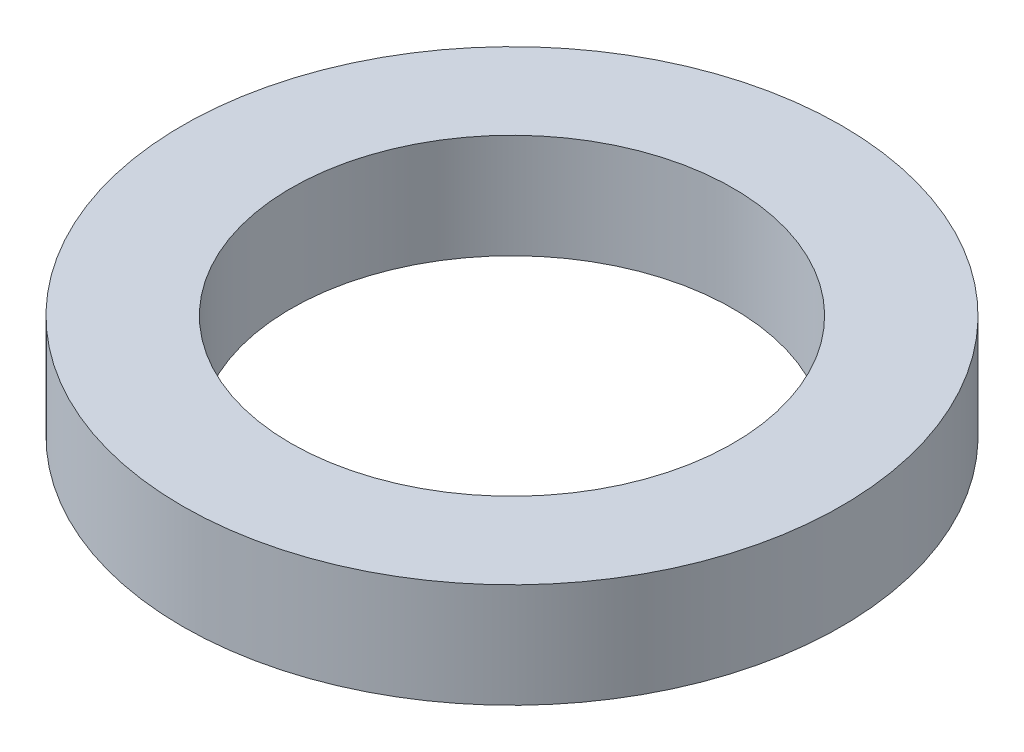
ISO-10303-21;
HEADER;
FILE_DESCRIPTION(('STEP AP214'),'2;1');
FILE_NAME('part.step','',(''),(''),'','','');
FILE_SCHEMA(('AUTOMOTIVE_DESIGN { 1 0 10303 214 1 1 1 1 }'));
ENDSEC;
DATA;
#1=APPLICATION_CONTEXT('core data for automotive mechanical design processes');
#2=APPLICATION_PROTOCOL_DEFINITION('international standard','automotive_design',2000,#1);
#3=PRODUCT_CONTEXT('',#1,'mechanical');
#4=PRODUCT('Part','Part','',(#3));
#5=PRODUCT_RELATED_PRODUCT_CATEGORY('part','',(#4));
#6=PRODUCT_DEFINITION_FORMATION('','',#4);
#7=PRODUCT_DEFINITION_CONTEXT('part definition',#1,'design');
#8=PRODUCT_DEFINITION('design','',#6,#7);
#9=PRODUCT_DEFINITION_SHAPE('','',#8);
#10=(LENGTH_UNIT() NAMED_UNIT(*) SI_UNIT(.MILLI.,.METRE.));
#11=(NAMED_UNIT(*) PLANE_ANGLE_UNIT() SI_UNIT($,.RADIAN.));
#12=(NAMED_UNIT(*) SI_UNIT($,.STERADIAN.) SOLID_ANGLE_UNIT());
#13=UNCERTAINTY_MEASURE_WITH_UNIT(LENGTH_MEASURE(1.E-05),#10,'distance_accuracy_value','');
#14=(GEOMETRIC_REPRESENTATION_CONTEXT(3) GLOBAL_UNCERTAINTY_ASSIGNED_CONTEXT((#13)) GLOBAL_UNIT_ASSIGNED_CONTEXT((#10,
#11,#12)) REPRESENTATION_CONTEXT('',''));
#15=CARTESIAN_POINT('',(0.,0.,0.));
#16=DIRECTION('',(0.,0.,1.));
#17=DIRECTION('',(1.,0.,0.));
#18=AXIS2_PLACEMENT_3D('',#15,#16,#17);
#19=CARTESIAN_POINT('',(4.025,1.9,0.));
#20=DIRECTION('',(0.,1.,0.));
#21=DIRECTION('',(0.,0.,1.));
#22=AXIS2_PLACEMENT_3D('',#19,#20,#21);
#23=PLANE('',#22);
#24=CARTESIAN_POINT('',(0.,1.9,0.));
#25=DIRECTION('',(0.,1.,0.));
#26=DIRECTION('',(0.,0.,1.));
#27=AXIS2_PLACEMENT_3D('',#24,#25,#26);
#28=CIRCLE('',#27,6.);
#29=CARTESIAN_POINT('',(0.,1.9,6.));
#30=VERTEX_POINT('',#29);
#31=EDGE_CURVE('E10',#30,#30,#28,.T.);
#32=ORIENTED_EDGE('',*,*,#31,.T.);
#33=EDGE_LOOP('',(#32));
#34=FACE_BOUND('',#33,.T.);
#35=CARTESIAN_POINT('',(0.,1.9,0.));
#36=DIRECTION('',(0.,1.,0.));
#37=DIRECTION('',(0.,0.,1.));
#38=AXIS2_PLACEMENT_3D('',#35,#36,#37);
#39=CIRCLE('',#38,4.025);
#40=CARTESIAN_POINT('',(0.,1.9,4.025));
#41=VERTEX_POINT('',#40);
#42=EDGE_CURVE('E49',#41,#41,#39,.T.);
#43=ORIENTED_EDGE('',*,*,#42,.F.);
#44=EDGE_LOOP('',(#43));
#45=FACE_BOUND('',#44,.T.);
#46=ADVANCED_FACE('F35',(#34,#45),#23,.T.);
#47=CARTESIAN_POINT('',(0.,0.,0.));
#48=DIRECTION('',(0.,1.,0.));
#49=DIRECTION('',(0.,0.,1.));
#50=AXIS2_PLACEMENT_3D('',#47,#48,#49);
#51=CYLINDRICAL_SURFACE('',#50,6.);
#52=CARTESIAN_POINT('',(0.,0.,0.));
#53=DIRECTION('',(0.,1.,0.));
#54=DIRECTION('',(0.,0.,1.));
#55=AXIS2_PLACEMENT_3D('',#52,#53,#54);
#56=CIRCLE('',#55,6.);
#57=CARTESIAN_POINT('',(0.,0.,6.));
#58=VERTEX_POINT('',#57);
#59=EDGE_CURVE('E41',#58,#58,#56,.T.);
#60=ORIENTED_EDGE('',*,*,#59,.T.);
#61=EDGE_LOOP('',(#60));
#62=FACE_BOUND('',#61,.T.);
#63=ORIENTED_EDGE('',*,*,#31,.F.);
#64=EDGE_LOOP('',(#63));
#65=FACE_BOUND('',#64,.T.);
#66=ADVANCED_FACE('F59',(#62,#65),#51,.T.);
#67=CARTESIAN_POINT('',(6.,0.,0.));
#68=DIRECTION('',(0.,-1.,0.));
#69=DIRECTION('',(0.,0.,-1.));
#70=AXIS2_PLACEMENT_3D('',#67,#68,#69);
#71=PLANE('',#70);
#72=CARTESIAN_POINT('',(0.,0.,0.));
#73=DIRECTION('',(0.,1.,0.));
#74=DIRECTION('',(0.,0.,1.));
#75=AXIS2_PLACEMENT_3D('',#72,#73,#74);
#76=CIRCLE('',#75,4.025);
#77=CARTESIAN_POINT('',(0.,0.,4.025));
#78=VERTEX_POINT('',#77);
#79=EDGE_CURVE('E45',#78,#78,#76,.T.);
#80=ORIENTED_EDGE('',*,*,#79,.T.);
#81=EDGE_LOOP('',(#80));
#82=FACE_BOUND('',#81,.T.);
#83=ORIENTED_EDGE('',*,*,#59,.F.);
#84=EDGE_LOOP('',(#83));
#85=FACE_BOUND('',#84,.T.);
#86=ADVANCED_FACE('F63',(#82,#85),#71,.T.);
#87=CARTESIAN_POINT('',(0.,0.,0.));
#88=DIRECTION('',(0.,1.,0.));
#89=DIRECTION('',(0.,0.,1.));
#90=AXIS2_PLACEMENT_3D('',#87,#88,#89);
#91=CYLINDRICAL_SURFACE('',#90,4.025);
#92=ORIENTED_EDGE('',*,*,#42,.T.);
#93=EDGE_LOOP('',(#92));
#94=FACE_BOUND('',#93,.T.);
#95=ORIENTED_EDGE('',*,*,#79,.F.);
#96=EDGE_LOOP('',(#95));
#97=FACE_BOUND('',#96,.T.);
#98=ADVANCED_FACE('F55',(#94,#97),#91,.F.);
#99=CLOSED_SHELL('',(#46,#66,#86,#98));
#100=MANIFOLD_SOLID_BREP('B2',#99);
#101=ADVANCED_BREP_SHAPE_REPRESENTATION('',(#18,#100),#14);
#102=SHAPE_DEFINITION_REPRESENTATION(#9,#101);
ENDSEC;
END-ISO-10303-21;
